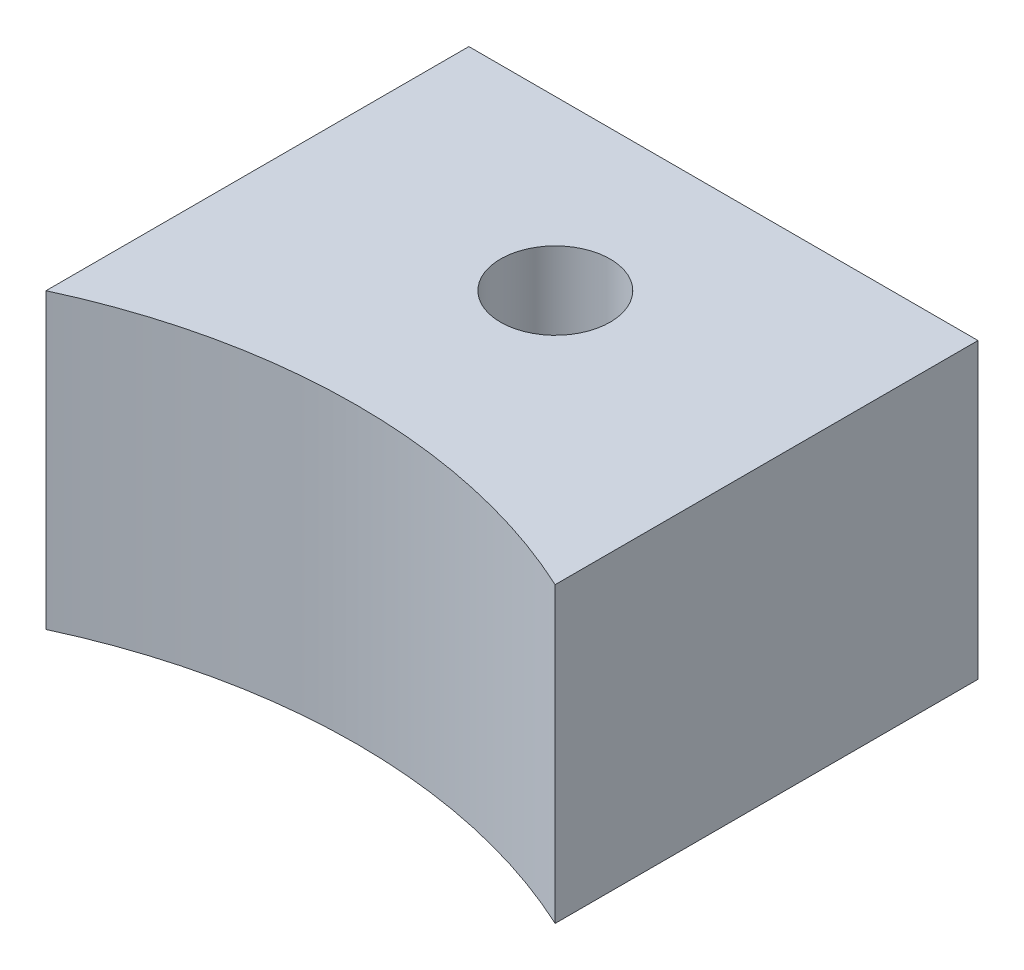
ISO-10303-21;
HEADER;
FILE_DESCRIPTION(('STEP AP214'),'2;1');
FILE_NAME('part.step','',(''),(''),'','','');
FILE_SCHEMA(('AUTOMOTIVE_DESIGN { 1 0 10303 214 1 1 1 1 }'));
ENDSEC;
DATA;
#1=APPLICATION_CONTEXT('core data for automotive mechanical design processes');
#2=APPLICATION_PROTOCOL_DEFINITION('international standard','automotive_design',2000,#1);
#3=PRODUCT_CONTEXT('',#1,'mechanical');
#4=PRODUCT('Part','Part','',(#3));
#5=PRODUCT_RELATED_PRODUCT_CATEGORY('part','',(#4));
#6=PRODUCT_DEFINITION_FORMATION('','',#4);
#7=PRODUCT_DEFINITION_CONTEXT('part definition',#1,'design');
#8=PRODUCT_DEFINITION('design','',#6,#7);
#9=PRODUCT_DEFINITION_SHAPE('','',#8);
#10=(LENGTH_UNIT() NAMED_UNIT(*) SI_UNIT(.MILLI.,.METRE.));
#11=(NAMED_UNIT(*) PLANE_ANGLE_UNIT() SI_UNIT($,.RADIAN.));
#12=(NAMED_UNIT(*) SI_UNIT($,.STERADIAN.) SOLID_ANGLE_UNIT());
#13=UNCERTAINTY_MEASURE_WITH_UNIT(LENGTH_MEASURE(1.E-05),#10,'distance_accuracy_value','');
#14=(GEOMETRIC_REPRESENTATION_CONTEXT(3) GLOBAL_UNCERTAINTY_ASSIGNED_CONTEXT((#13)) GLOBAL_UNIT_ASSIGNED_CONTEXT((#10,
#11,#12)) REPRESENTATION_CONTEXT('',''));
#15=CARTESIAN_POINT('',(0.,0.,0.));
#16=DIRECTION('',(0.,0.,1.));
#17=DIRECTION('',(1.,0.,0.));
#18=AXIS2_PLACEMENT_3D('',#15,#16,#17);
#19=CARTESIAN_POINT('',(0.,17.,56.2401559542483));
#20=DIRECTION('',(0.,-1.,0.));
#21=DIRECTION('',(0.,0.,-1.));
#22=AXIS2_PLACEMENT_3D('',#19,#20,#21);
#23=PLANE('',#22);
#24=DIRECTION('',(0.,0.,1.));
#25=VECTOR('',#24,1.);
#26=CARTESIAN_POINT('',(-14.75,17.,0.));
#27=LINE('',#26,#25);
#28=CARTESIAN_POINT('',(-14.75,17.,0.));
#29=VERTEX_POINT('',#28);
#30=CARTESIAN_POINT('',(-14.75,17.,24.5));
#31=VERTEX_POINT('',#30);
#32=EDGE_CURVE('E84',#29,#31,#27,.T.);
#33=ORIENTED_EDGE('',*,*,#32,.T.);
#34=CARTESIAN_POINT('',(0.,17.,56.2401559542483));
#35=DIRECTION('',(0.,-1.,0.));
#36=DIRECTION('',(0.,0.,-1.));
#37=AXIS2_PLACEMENT_3D('',#34,#35,#36);
#38=CIRCLE('',#37,35.);
#39=CARTESIAN_POINT('',(14.75,17.,24.5));
#40=VERTEX_POINT('',#39);
#41=EDGE_CURVE('E79',#31,#40,#38,.T.);
#42=ORIENTED_EDGE('',*,*,#41,.T.);
#43=DIRECTION('',(0.,0.,-1.));
#44=VECTOR('',#43,1.);
#45=CARTESIAN_POINT('',(14.75,17.,0.));
#46=LINE('',#45,#44);
#47=CARTESIAN_POINT('',(14.75,17.,0.));
#48=VERTEX_POINT('',#47);
#49=EDGE_CURVE('E82',#40,#48,#46,.T.);
#50=ORIENTED_EDGE('',*,*,#49,.T.);
#51=DIRECTION('',(-1.,0.,0.));
#52=VECTOR('',#51,1.);
#53=CARTESIAN_POINT('',(-14.75,17.,0.));
#54=LINE('',#53,#52);
#55=EDGE_CURVE('E49',#48,#29,#54,.T.);
#56=ORIENTED_EDGE('',*,*,#55,.T.);
#57=EDGE_LOOP('',(#33,#42,#50,#56));
#58=FACE_BOUND('',#57,.T.);
#59=CARTESIAN_POINT('',(0.,17.,9.74015595424825));
#60=DIRECTION('',(0.,1.,0.));
#61=DIRECTION('',(0.,0.,1.));
#62=AXIS2_PLACEMENT_3D('',#59,#60,#61);
#63=CIRCLE('',#62,3.175);
#64=CARTESIAN_POINT('',(0.,17.,12.9151559542483));
#65=VERTEX_POINT('',#64);
#66=EDGE_CURVE('E99',#65,#65,#63,.T.);
#67=ORIENTED_EDGE('',*,*,#66,.F.);
#68=EDGE_LOOP('',(#67));
#69=FACE_BOUND('',#68,.T.);
#70=ADVANCED_FACE('F32',(#58,#69),#23,.F.);
#71=CARTESIAN_POINT('',(0.,0.,56.2401559542483));
#72=DIRECTION('',(0.,-1.,0.));
#73=DIRECTION('',(0.,0.,-1.));
#74=AXIS2_PLACEMENT_3D('',#71,#72,#73);
#75=PLANE('',#74);
#76=DIRECTION('',(0.,0.,1.));
#77=VECTOR('',#76,1.);
#78=CARTESIAN_POINT('',(-14.75,0.,0.));
#79=LINE('',#78,#77);
#80=CARTESIAN_POINT('',(-14.75,0.,0.));
#81=VERTEX_POINT('',#80);
#82=CARTESIAN_POINT('',(-14.75,0.,24.5));
#83=VERTEX_POINT('',#82);
#84=EDGE_CURVE('E96',#81,#83,#79,.T.);
#85=ORIENTED_EDGE('',*,*,#84,.F.);
#86=DIRECTION('',(-1.,0.,0.));
#87=VECTOR('',#86,1.);
#88=CARTESIAN_POINT('',(-14.75,0.,0.));
#89=LINE('',#88,#87);
#90=CARTESIAN_POINT('',(14.75,0.,0.));
#91=VERTEX_POINT('',#90);
#92=EDGE_CURVE('E72',#91,#81,#89,.T.);
#93=ORIENTED_EDGE('',*,*,#92,.F.);
#94=DIRECTION('',(0.,0.,-1.));
#95=VECTOR('',#94,1.);
#96=CARTESIAN_POINT('',(14.75,0.,0.));
#97=LINE('',#96,#95);
#98=CARTESIAN_POINT('',(14.75,0.,24.5));
#99=VERTEX_POINT('',#98);
#100=EDGE_CURVE('E66',#99,#91,#97,.T.);
#101=ORIENTED_EDGE('',*,*,#100,.F.);
#102=CARTESIAN_POINT('',(0.,0.,56.2401559542483));
#103=DIRECTION('',(0.,-1.,0.));
#104=DIRECTION('',(0.,0.,-1.));
#105=AXIS2_PLACEMENT_3D('',#102,#103,#104);
#106=CIRCLE('',#105,35.);
#107=EDGE_CURVE('E88',#83,#99,#106,.T.);
#108=ORIENTED_EDGE('',*,*,#107,.F.);
#109=EDGE_LOOP('',(#85,#93,#101,#108));
#110=FACE_BOUND('',#109,.T.);
#111=CARTESIAN_POINT('',(0.,0.,9.74015595424825));
#112=DIRECTION('',(0.,1.,0.));
#113=DIRECTION('',(0.,0.,1.));
#114=AXIS2_PLACEMENT_3D('',#111,#112,#113);
#115=CIRCLE('',#114,3.175);
#116=CARTESIAN_POINT('',(0.,0.,12.9151559542483));
#117=VERTEX_POINT('',#116);
#118=EDGE_CURVE('E111',#117,#117,#115,.T.);
#119=ORIENTED_EDGE('',*,*,#118,.T.);
#120=EDGE_LOOP('',(#119));
#121=FACE_BOUND('',#120,.T.);
#122=ADVANCED_FACE('F107',(#110,#121),#75,.T.);
#123=CARTESIAN_POINT('',(-14.75,17.,0.));
#124=DIRECTION('',(1.,0.,0.));
#125=DIRECTION('',(0.,0.,-1.));
#126=AXIS2_PLACEMENT_3D('',#123,#124,#125);
#127=PLANE('',#126);
#128=ORIENTED_EDGE('',*,*,#84,.T.);
#129=DIRECTION('',(0.,-1.,0.));
#130=VECTOR('',#129,1.);
#131=CARTESIAN_POINT('',(-14.75,17.,24.5));
#132=LINE('',#131,#130);
#133=EDGE_CURVE('E11',#31,#83,#132,.T.);
#134=ORIENTED_EDGE('',*,*,#133,.F.);
#135=ORIENTED_EDGE('',*,*,#32,.F.);
#136=DIRECTION('',(0.,-1.,0.));
#137=VECTOR('',#136,1.);
#138=CARTESIAN_POINT('',(-14.75,17.,0.));
#139=LINE('',#138,#137);
#140=EDGE_CURVE('E92',#29,#81,#139,.T.);
#141=ORIENTED_EDGE('',*,*,#140,.T.);
#142=EDGE_LOOP('',(#128,#134,#135,#141));
#143=FACE_BOUND('',#142,.T.);
#144=ADVANCED_FACE('F34',(#143),#127,.F.);
#145=CARTESIAN_POINT('',(0.,17.,56.2401559542483));
#146=DIRECTION('',(0.,-1.,0.));
#147=DIRECTION('',(0.,0.,-1.));
#148=AXIS2_PLACEMENT_3D('',#145,#146,#147);
#149=CYLINDRICAL_SURFACE('',#148,35.);
#150=ORIENTED_EDGE('',*,*,#107,.T.);
#151=DIRECTION('',(0.,-1.,0.));
#152=VECTOR('',#151,1.);
#153=CARTESIAN_POINT('',(14.75,17.,24.5));
#154=LINE('',#153,#152);
#155=EDGE_CURVE('E41',#40,#99,#154,.T.);
#156=ORIENTED_EDGE('',*,*,#155,.F.);
#157=ORIENTED_EDGE('',*,*,#41,.F.);
#158=ORIENTED_EDGE('',*,*,#133,.T.);
#159=EDGE_LOOP('',(#150,#156,#157,#158));
#160=FACE_BOUND('',#159,.T.);
#161=ADVANCED_FACE('F87',(#160),#149,.F.);
#162=CARTESIAN_POINT('',(14.75,17.,0.));
#163=DIRECTION('',(-1.,0.,0.));
#164=DIRECTION('',(0.,0.,1.));
#165=AXIS2_PLACEMENT_3D('',#162,#163,#164);
#166=PLANE('',#165);
#167=ORIENTED_EDGE('',*,*,#100,.T.);
#168=DIRECTION('',(0.,-1.,0.));
#169=VECTOR('',#168,1.);
#170=CARTESIAN_POINT('',(14.75,17.,0.));
#171=LINE('',#170,#169);
#172=EDGE_CURVE('E89',#48,#91,#171,.T.);
#173=ORIENTED_EDGE('',*,*,#172,.F.);
#174=ORIENTED_EDGE('',*,*,#49,.F.);
#175=ORIENTED_EDGE('',*,*,#155,.T.);
#176=EDGE_LOOP('',(#167,#173,#174,#175));
#177=FACE_BOUND('',#176,.T.);
#178=ADVANCED_FACE('F90',(#177),#166,.F.);
#179=CARTESIAN_POINT('',(-14.75,17.,0.));
#180=DIRECTION('',(0.,0.,1.));
#181=DIRECTION('',(1.,0.,0.));
#182=AXIS2_PLACEMENT_3D('',#179,#180,#181);
#183=PLANE('',#182);
#184=ORIENTED_EDGE('',*,*,#92,.T.);
#185=ORIENTED_EDGE('',*,*,#140,.F.);
#186=ORIENTED_EDGE('',*,*,#55,.F.);
#187=ORIENTED_EDGE('',*,*,#172,.T.);
#188=EDGE_LOOP('',(#184,#185,#186,#187));
#189=FACE_BOUND('',#188,.T.);
#190=ADVANCED_FACE('F104',(#189),#183,.F.);
#191=CARTESIAN_POINT('',(0.,17.,9.74015595424825));
#192=DIRECTION('',(0.,-1.,0.));
#193=DIRECTION('',(0.,0.,-1.));
#194=AXIS2_PLACEMENT_3D('',#191,#192,#193);
#195=CYLINDRICAL_SURFACE('',#194,3.175);
#196=ORIENTED_EDGE('',*,*,#66,.T.);
#197=EDGE_LOOP('',(#196));
#198=FACE_BOUND('',#197,.T.);
#199=ORIENTED_EDGE('',*,*,#118,.F.);
#200=EDGE_LOOP('',(#199));
#201=FACE_BOUND('',#200,.T.);
#202=ADVANCED_FACE('F117',(#198,#201),#195,.F.);
#203=CLOSED_SHELL('',(#70,#122,#144,#161,#178,#190,#202));
#204=MANIFOLD_SOLID_BREP('B2',#203);
#205=ADVANCED_BREP_SHAPE_REPRESENTATION('',(#18,#204),#14);
#206=SHAPE_DEFINITION_REPRESENTATION(#9,#205);
ENDSEC;
END-ISO-10303-21;
